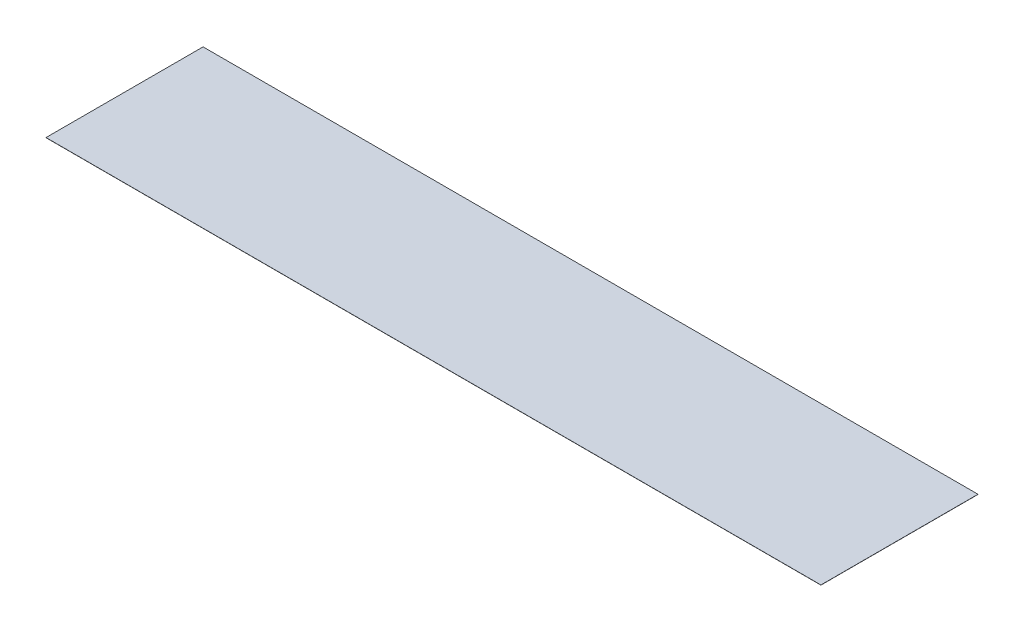
ISO-10303-21;
HEADER;
FILE_DESCRIPTION(('STEP AP214'),'2;1');
FILE_NAME('part.step','',(''),(''),'','','');
FILE_SCHEMA(('AUTOMOTIVE_DESIGN { 1 0 10303 214 1 1 1 1 }'));
ENDSEC;
DATA;
#1=APPLICATION_CONTEXT('core data for automotive mechanical design processes');
#2=APPLICATION_PROTOCOL_DEFINITION('international standard','automotive_design',2000,#1);
#3=PRODUCT_CONTEXT('',#1,'mechanical');
#4=PRODUCT('Part','Part','',(#3));
#5=PRODUCT_RELATED_PRODUCT_CATEGORY('part','',(#4));
#6=PRODUCT_DEFINITION_FORMATION('','',#4);
#7=PRODUCT_DEFINITION_CONTEXT('part definition',#1,'design');
#8=PRODUCT_DEFINITION('design','',#6,#7);
#9=PRODUCT_DEFINITION_SHAPE('','',#8);
#10=(LENGTH_UNIT() NAMED_UNIT(*) SI_UNIT(.MILLI.,.METRE.));
#11=(NAMED_UNIT(*) PLANE_ANGLE_UNIT() SI_UNIT($,.RADIAN.));
#12=(NAMED_UNIT(*) SI_UNIT($,.STERADIAN.) SOLID_ANGLE_UNIT());
#13=UNCERTAINTY_MEASURE_WITH_UNIT(LENGTH_MEASURE(1.E-05),#10,'distance_accuracy_value','');
#14=(GEOMETRIC_REPRESENTATION_CONTEXT(3) GLOBAL_UNCERTAINTY_ASSIGNED_CONTEXT((#13)) GLOBAL_UNIT_ASSIGNED_CONTEXT((#10,
#11,#12)) REPRESENTATION_CONTEXT('',''));
#15=CARTESIAN_POINT('',(0.,0.,0.));
#16=DIRECTION('',(0.,0.,1.));
#17=DIRECTION('',(1.,0.,0.));
#18=AXIS2_PLACEMENT_3D('',#15,#16,#17);
#19=CARTESIAN_POINT('',(-11277.6,4.7752,0.));
#20=DIRECTION('',(1.,0.,0.));
#21=DIRECTION('',(0.,0.,-1.));
#22=AXIS2_PLACEMENT_3D('',#19,#20,#21);
#23=PLANE('',#22);
#24=DIRECTION('',(0.,0.,1.));
#25=VECTOR('',#24,1.);
#26=CARTESIAN_POINT('',(-11277.6,0.,0.));
#27=LINE('',#26,#25);
#28=CARTESIAN_POINT('',(-11277.6,0.,-4572.));
#29=VERTEX_POINT('',#28);
#30=CARTESIAN_POINT('',(-11277.6,0.,0.));
#31=VERTEX_POINT('',#30);
#32=EDGE_CURVE('E98',#29,#31,#27,.T.);
#33=ORIENTED_EDGE('',*,*,#32,.T.);
#34=DIRECTION('',(0.,-1.,0.));
#35=VECTOR('',#34,1.);
#36=CARTESIAN_POINT('',(-11277.6,4.7752,0.));
#37=LINE('',#36,#35);
#38=CARTESIAN_POINT('',(-11277.6,4.7752,0.));
#39=VERTEX_POINT('',#38);
#40=EDGE_CURVE('E11',#39,#31,#37,.T.);
#41=ORIENTED_EDGE('',*,*,#40,.F.);
#42=DIRECTION('',(0.,0.,1.));
#43=VECTOR('',#42,1.);
#44=CARTESIAN_POINT('',(-11277.6,4.7752,0.));
#45=LINE('',#44,#43);
#46=CARTESIAN_POINT('',(-11277.6,4.7752,-4572.));
#47=VERTEX_POINT('',#46);
#48=EDGE_CURVE('E86',#47,#39,#45,.T.);
#49=ORIENTED_EDGE('',*,*,#48,.F.);
#50=DIRECTION('',(0.,-1.,0.));
#51=VECTOR('',#50,1.);
#52=CARTESIAN_POINT('',(-11277.6,4.7752,-4572.));
#53=LINE('',#52,#51);
#54=EDGE_CURVE('E94',#47,#29,#53,.T.);
#55=ORIENTED_EDGE('',*,*,#54,.T.);
#56=EDGE_LOOP('',(#33,#41,#49,#55));
#57=FACE_BOUND('',#56,.T.);
#58=ADVANCED_FACE('F35',(#57),#23,.F.);
#59=CARTESIAN_POINT('',(-11277.6,4.7752,0.));
#60=DIRECTION('',(0.,0.,-1.));
#61=DIRECTION('',(-1.,0.,0.));
#62=AXIS2_PLACEMENT_3D('',#59,#60,#61);
#63=PLANE('',#62);
#64=DIRECTION('',(1.,0.,0.));
#65=VECTOR('',#64,1.);
#66=CARTESIAN_POINT('',(-11277.6,0.,0.));
#67=LINE('',#66,#65);
#68=CARTESIAN_POINT('',(11277.6,0.,-4.21884749357559E-12));
#69=VERTEX_POINT('',#68);
#70=EDGE_CURVE('E90',#31,#69,#67,.T.);
#71=ORIENTED_EDGE('',*,*,#70,.T.);
#72=DIRECTION('',(0.,-1.,0.));
#73=VECTOR('',#72,1.);
#74=CARTESIAN_POINT('',(11277.6,4.7752,-4.21884749357559E-12));
#75=LINE('',#74,#73);
#76=CARTESIAN_POINT('',(11277.6,4.7752,-4.21884749357559E-12));
#77=VERTEX_POINT('',#76);
#78=EDGE_CURVE('E43',#77,#69,#75,.T.);
#79=ORIENTED_EDGE('',*,*,#78,.F.);
#80=DIRECTION('',(1.,0.,0.));
#81=VECTOR('',#80,1.);
#82=CARTESIAN_POINT('',(-11277.6,4.7752,0.));
#83=LINE('',#82,#81);
#84=EDGE_CURVE('E81',#39,#77,#83,.T.);
#85=ORIENTED_EDGE('',*,*,#84,.F.);
#86=ORIENTED_EDGE('',*,*,#40,.T.);
#87=EDGE_LOOP('',(#71,#79,#85,#86));
#88=FACE_BOUND('',#87,.T.);
#89=ADVANCED_FACE('F89',(#88),#63,.F.);
#90=CARTESIAN_POINT('',(11277.6,4.7752,-4.21884749357559E-12));
#91=DIRECTION('',(-1.,0.,0.));
#92=DIRECTION('',(0.,0.,1.));
#93=AXIS2_PLACEMENT_3D('',#90,#91,#92);
#94=PLANE('',#93);
#95=DIRECTION('',(0.,0.,-1.));
#96=VECTOR('',#95,1.);
#97=CARTESIAN_POINT('',(11277.6,0.,-4.21884749357559E-12));
#98=LINE('',#97,#96);
#99=CARTESIAN_POINT('',(11277.6,0.,-4572.));
#100=VERTEX_POINT('',#99);
#101=EDGE_CURVE('E68',#69,#100,#98,.T.);
#102=ORIENTED_EDGE('',*,*,#101,.T.);
#103=DIRECTION('',(0.,-1.,0.));
#104=VECTOR('',#103,1.);
#105=CARTESIAN_POINT('',(11277.6,4.7752,-4572.));
#106=LINE('',#105,#104);
#107=CARTESIAN_POINT('',(11277.6,4.7752,-4572.));
#108=VERTEX_POINT('',#107);
#109=EDGE_CURVE('E91',#108,#100,#106,.T.);
#110=ORIENTED_EDGE('',*,*,#109,.F.);
#111=DIRECTION('',(0.,0.,-1.));
#112=VECTOR('',#111,1.);
#113=CARTESIAN_POINT('',(11277.6,4.7752,-4.21884749357559E-12));
#114=LINE('',#113,#112);
#115=EDGE_CURVE('E84',#77,#108,#114,.T.);
#116=ORIENTED_EDGE('',*,*,#115,.F.);
#117=ORIENTED_EDGE('',*,*,#78,.T.);
#118=EDGE_LOOP('',(#102,#110,#116,#117));
#119=FACE_BOUND('',#118,.T.);
#120=ADVANCED_FACE('F92',(#119),#94,.F.);
#121=CARTESIAN_POINT('',(-11277.6,4.7752,-4572.));
#122=DIRECTION('',(0.,0.,1.));
#123=DIRECTION('',(1.,0.,0.));
#124=AXIS2_PLACEMENT_3D('',#121,#122,#123);
#125=PLANE('',#124);
#126=DIRECTION('',(-1.,0.,0.));
#127=VECTOR('',#126,1.);
#128=CARTESIAN_POINT('',(-11277.6,0.,-4572.));
#129=LINE('',#128,#127);
#130=EDGE_CURVE('E74',#100,#29,#129,.T.);
#131=ORIENTED_EDGE('',*,*,#130,.T.);
#132=ORIENTED_EDGE('',*,*,#54,.F.);
#133=DIRECTION('',(-1.,0.,0.));
#134=VECTOR('',#133,1.);
#135=CARTESIAN_POINT('',(-11277.6,4.7752,-4572.));
#136=LINE('',#135,#134);
#137=EDGE_CURVE('E51',#108,#47,#136,.T.);
#138=ORIENTED_EDGE('',*,*,#137,.F.);
#139=ORIENTED_EDGE('',*,*,#109,.T.);
#140=EDGE_LOOP('',(#131,#132,#138,#139));
#141=FACE_BOUND('',#140,.T.);
#142=ADVANCED_FACE('F105',(#141),#125,.F.);
#143=CARTESIAN_POINT('',(0.,4.7752,0.));
#144=DIRECTION('',(0.,-1.,0.));
#145=DIRECTION('',(0.,0.,-1.));
#146=AXIS2_PLACEMENT_3D('',#143,#144,#145);
#147=PLANE('',#146);
#148=ORIENTED_EDGE('',*,*,#48,.T.);
#149=ORIENTED_EDGE('',*,*,#84,.T.);
#150=ORIENTED_EDGE('',*,*,#115,.T.);
#151=ORIENTED_EDGE('',*,*,#137,.T.);
#152=EDGE_LOOP('',(#148,#149,#150,#151));
#153=FACE_BOUND('',#152,.T.);
#154=ADVANCED_FACE('F82',(#153),#147,.F.);
#155=CARTESIAN_POINT('',(0.,0.,0.));
#156=DIRECTION('',(0.,-1.,0.));
#157=DIRECTION('',(0.,0.,-1.));
#158=AXIS2_PLACEMENT_3D('',#155,#156,#157);
#159=PLANE('',#158);
#160=ORIENTED_EDGE('',*,*,#32,.F.);
#161=ORIENTED_EDGE('',*,*,#130,.F.);
#162=ORIENTED_EDGE('',*,*,#101,.F.);
#163=ORIENTED_EDGE('',*,*,#70,.F.);
#164=EDGE_LOOP('',(#160,#161,#162,#163));
#165=FACE_BOUND('',#164,.T.);
#166=ADVANCED_FACE('F108',(#165),#159,.T.);
#167=CLOSED_SHELL('',(#58,#89,#120,#142,#154,#166));
#168=MANIFOLD_SOLID_BREP('B2',#167);
#169=ADVANCED_BREP_SHAPE_REPRESENTATION('',(#18,#168),#14);
#170=SHAPE_DEFINITION_REPRESENTATION(#9,#169);
ENDSEC;
END-ISO-10303-21;
